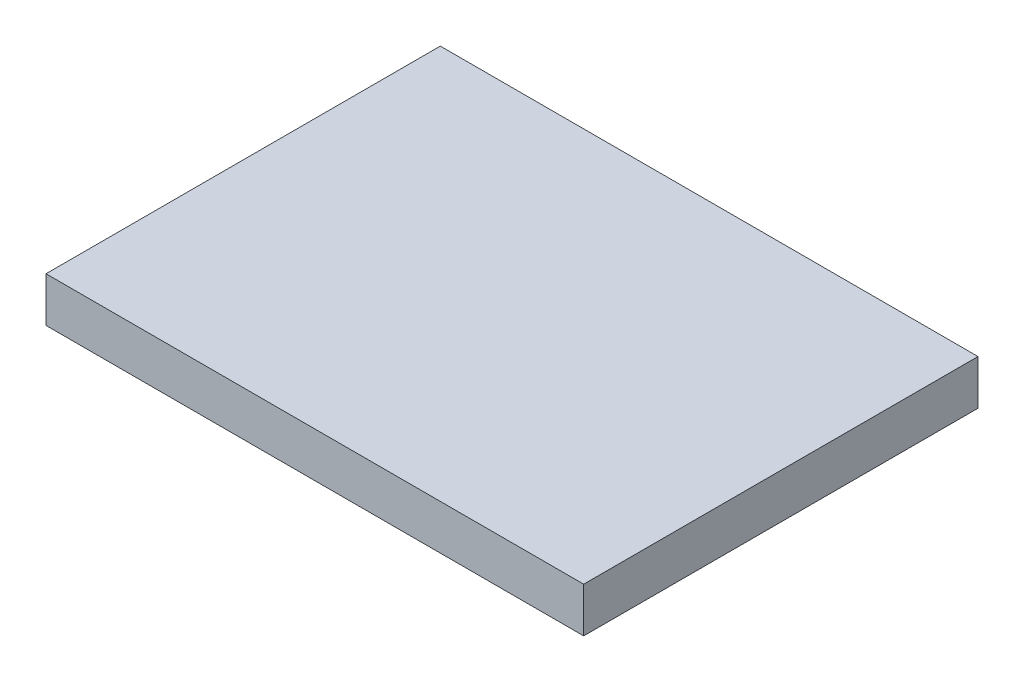
ISO-10303-21;
HEADER;
FILE_DESCRIPTION(('STEP AP214'),'2;1');
FILE_NAME('part.step','',(''),(''),'','','');
FILE_SCHEMA(('AUTOMOTIVE_DESIGN { 1 0 10303 214 1 1 1 1 }'));
ENDSEC;
DATA;
#1=APPLICATION_CONTEXT('core data for automotive mechanical design processes');
#2=APPLICATION_PROTOCOL_DEFINITION('international standard','automotive_design',2000,#1);
#3=PRODUCT_CONTEXT('',#1,'mechanical');
#4=PRODUCT('Part','Part','',(#3));
#5=PRODUCT_RELATED_PRODUCT_CATEGORY('part','',(#4));
#6=PRODUCT_DEFINITION_FORMATION('','',#4);
#7=PRODUCT_DEFINITION_CONTEXT('part definition',#1,'design');
#8=PRODUCT_DEFINITION('design','',#6,#7);
#9=PRODUCT_DEFINITION_SHAPE('','',#8);
#10=(LENGTH_UNIT() NAMED_UNIT(*) SI_UNIT(.MILLI.,.METRE.));
#11=(NAMED_UNIT(*) PLANE_ANGLE_UNIT() SI_UNIT($,.RADIAN.));
#12=(NAMED_UNIT(*) SI_UNIT($,.STERADIAN.) SOLID_ANGLE_UNIT());
#13=UNCERTAINTY_MEASURE_WITH_UNIT(LENGTH_MEASURE(1.E-05),#10,'distance_accuracy_value','');
#14=(GEOMETRIC_REPRESENTATION_CONTEXT(3) GLOBAL_UNCERTAINTY_ASSIGNED_CONTEXT((#13)) GLOBAL_UNIT_ASSIGNED_CONTEXT((#10,
#11,#12)) REPRESENTATION_CONTEXT('',''));
#15=CARTESIAN_POINT('',(0.,0.,0.));
#16=DIRECTION('',(0.,0.,1.));
#17=DIRECTION('',(1.,0.,0.));
#18=AXIS2_PLACEMENT_3D('',#15,#16,#17);
#19=CARTESIAN_POINT('',(87.1296662850509,831.639308698317,11.1125));
#20=DIRECTION('',(0.,0.,-1.));
#21=DIRECTION('',(-1.,0.,0.));
#22=AXIS2_PLACEMENT_3D('',#19,#20,#21);
#23=CYLINDRICAL_SURFACE('',#22,31.75);
#24=CARTESIAN_POINT('',(87.1296662850509,831.639308698317,-11.1125));
#25=DIRECTION('',(0.,0.,1.));
#26=DIRECTION('',(1.,0.,0.));
#27=AXIS2_PLACEMENT_3D('',#24,#25,#26);
#28=CIRCLE('',#27,31.75);
#29=CARTESIAN_POINT('',(118.879666285051,831.639308698317,-11.1125));
#30=VERTEX_POINT('',#29);
#31=CARTESIAN_POINT('',(55.3796662850509,831.639308698317,-11.1125));
#32=VERTEX_POINT('',#31);
#33=EDGE_CURVE('E70',#30,#32,#28,.F.);
#34=ORIENTED_EDGE('',*,*,#33,.F.);
#35=DIRECTION('',(0.,0.,-1.));
#36=VECTOR('',#35,1.);
#37=CARTESIAN_POINT('',(118.879666285051,831.639308698317,11.1125));
#38=LINE('',#37,#36);
#39=CARTESIAN_POINT('',(118.879666285051,831.639308698317,11.1125));
#40=VERTEX_POINT('',#39);
#41=EDGE_CURVE('E11',#40,#30,#38,.T.);
#42=ORIENTED_EDGE('',*,*,#41,.F.);
#43=CARTESIAN_POINT('',(87.1296662850509,831.639308698317,11.1125));
#44=DIRECTION('',(0.,0.,1.));
#45=DIRECTION('',(1.,0.,0.));
#46=AXIS2_PLACEMENT_3D('',#43,#44,#45);
#47=CIRCLE('',#46,31.75);
#48=CARTESIAN_POINT('',(55.3796662850509,831.639308698317,11.1125));
#49=VERTEX_POINT('',#48);
#50=EDGE_CURVE('E72',#40,#49,#47,.F.);
#51=ORIENTED_EDGE('',*,*,#50,.T.);
#52=DIRECTION('',(0.,0.,-1.));
#53=VECTOR('',#52,1.);
#54=CARTESIAN_POINT('',(55.3796662850509,831.639308698317,11.1125));
#55=LINE('',#54,#53);
#56=EDGE_CURVE('E52',#49,#32,#55,.T.);
#57=ORIENTED_EDGE('',*,*,#56,.T.);
#58=EDGE_LOOP('',(#34,#42,#51,#57));
#59=FACE_BOUND('',#58,.T.);
#60=ADVANCED_FACE('F35',(#59),#23,.T.);
#61=CARTESIAN_POINT('',(118.879666285051,304.056568512101,11.1125));
#62=DIRECTION('',(-1.,0.,0.));
#63=DIRECTION('',(0.,0.,1.));
#64=AXIS2_PLACEMENT_3D('',#61,#62,#63);
#65=PLANE('',#64);
#66=DIRECTION('',(0.,1.,0.));
#67=VECTOR('',#66,1.);
#68=CARTESIAN_POINT('',(118.879666285051,304.056568512101,-11.1125));
#69=LINE('',#68,#67);
#70=CARTESIAN_POINT('',(118.879666285051,867.199308698317,-11.1125));
#71=VERTEX_POINT('',#70);
#72=EDGE_CURVE('E84',#30,#71,#69,.T.);
#73=ORIENTED_EDGE('',*,*,#72,.T.);
#74=DIRECTION('',(0.,0.,-1.));
#75=VECTOR('',#74,1.);
#76=CARTESIAN_POINT('',(118.879666285051,867.199308698317,11.1125));
#77=LINE('',#76,#75);
#78=CARTESIAN_POINT('',(118.879666285051,867.199308698317,11.1125));
#79=VERTEX_POINT('',#78);
#80=EDGE_CURVE('E44',#79,#71,#77,.T.);
#81=ORIENTED_EDGE('',*,*,#80,.F.);
#82=DIRECTION('',(0.,1.,0.));
#83=VECTOR('',#82,1.);
#84=CARTESIAN_POINT('',(118.879666285051,304.056568512101,11.1125));
#85=LINE('',#84,#83);
#86=EDGE_CURVE('E105',#40,#79,#85,.T.);
#87=ORIENTED_EDGE('',*,*,#86,.F.);
#88=ORIENTED_EDGE('',*,*,#41,.T.);
#89=EDGE_LOOP('',(#73,#81,#87,#88));
#90=FACE_BOUND('',#89,.T.);
#91=ADVANCED_FACE('F181',(#90),#65,.F.);
#92=CARTESIAN_POINT('',(87.1296662850509,831.639308698317,11.1125));
#93=DIRECTION('',(0.,0.,-1.));
#94=DIRECTION('',(-1.,0.,0.));
#95=AXIS2_PLACEMENT_3D('',#92,#93,#94);
#96=CYLINDRICAL_SURFACE('',#95,7.93750000000001);
#97=CARTESIAN_POINT('',(87.1296662850509,831.639308698317,11.1125));
#98=DIRECTION('',(0.,0.,1.));
#99=DIRECTION('',(1.,0.,0.));
#100=AXIS2_PLACEMENT_3D('',#97,#98,#99);
#101=CIRCLE('',#100,7.93750000000001);
#102=CARTESIAN_POINT('',(95.0671662850509,831.639308698317,11.1125));
#103=VERTEX_POINT('',#102);
#104=EDGE_CURVE('E90',#103,#103,#101,.T.);
#105=ORIENTED_EDGE('',*,*,#104,.T.);
#106=EDGE_LOOP('',(#105));
#107=FACE_BOUND('',#106,.T.);
#108=CARTESIAN_POINT('',(87.1296662850509,831.639308698317,-11.1125));
#109=DIRECTION('',(0.,0.,1.));
#110=DIRECTION('',(1.,0.,0.));
#111=AXIS2_PLACEMENT_3D('',#108,#109,#110);
#112=CIRCLE('',#111,7.93750000000001);
#113=CARTESIAN_POINT('',(95.0671662850509,831.639308698317,-11.1125));
#114=VERTEX_POINT('',#113);
#115=EDGE_CURVE('E85',#114,#114,#112,.T.);
#116=ORIENTED_EDGE('',*,*,#115,.F.);
#117=EDGE_LOOP('',(#116));
#118=FACE_BOUND('',#117,.T.);
#119=ADVANCED_FACE('F37',(#107,#118),#96,.F.);
#120=CARTESIAN_POINT('',(55.3796662850509,304.056568512101,11.1125));
#121=DIRECTION('',(-1.,0.,0.));
#122=DIRECTION('',(0.,0.,1.));
#123=AXIS2_PLACEMENT_3D('',#120,#121,#122);
#124=PLANE('',#123);
#125=DIRECTION('',(0.,1.,0.));
#126=VECTOR('',#125,1.);
#127=CARTESIAN_POINT('',(55.3796662850509,304.056568512101,-11.1125));
#128=LINE('',#127,#126);
#129=CARTESIAN_POINT('',(55.3796662850509,867.199308698317,-11.1125));
#130=VERTEX_POINT('',#129);
#131=EDGE_CURVE('E83',#32,#130,#128,.T.);
#132=ORIENTED_EDGE('',*,*,#131,.F.);
#133=ORIENTED_EDGE('',*,*,#56,.F.);
#134=DIRECTION('',(0.,1.,0.));
#135=VECTOR('',#134,1.);
#136=CARTESIAN_POINT('',(55.3796662850509,304.056568512101,11.1125));
#137=LINE('',#136,#135);
#138=CARTESIAN_POINT('',(55.3796662850509,867.199308698317,11.1125));
#139=VERTEX_POINT('',#138);
#140=EDGE_CURVE('E75',#49,#139,#137,.T.);
#141=ORIENTED_EDGE('',*,*,#140,.T.);
#142=DIRECTION('',(0.,0.,-1.));
#143=VECTOR('',#142,1.);
#144=CARTESIAN_POINT('',(55.3796662850509,867.199308698317,11.1125));
#145=LINE('',#144,#143);
#146=EDGE_CURVE('E74',#139,#130,#145,.T.);
#147=ORIENTED_EDGE('',*,*,#146,.T.);
#148=EDGE_LOOP('',(#132,#133,#141,#147));
#149=FACE_BOUND('',#148,.T.);
#150=ADVANCED_FACE('F88',(#149),#124,.T.);
#151=CARTESIAN_POINT('',(87.1296662850509,304.056568512101,11.1125));
#152=DIRECTION('',(0.,0.,1.));
#153=DIRECTION('',(1.,0.,0.));
#154=AXIS2_PLACEMENT_3D('',#151,#152,#153);
#155=PLANE('',#154);
#156=ORIENTED_EDGE('',*,*,#104,.F.);
#157=EDGE_LOOP('',(#156));
#158=FACE_BOUND('',#157,.T.);
#159=ORIENTED_EDGE('',*,*,#50,.F.);
#160=ORIENTED_EDGE('',*,*,#86,.T.);
#161=DIRECTION('',(1.,0.,0.));
#162=VECTOR('',#161,1.);
#163=CARTESIAN_POINT('',(87.1296662850509,867.199308698317,11.1125));
#164=LINE('',#163,#162);
#165=EDGE_CURVE('E103',#139,#79,#164,.T.);
#166=ORIENTED_EDGE('',*,*,#165,.F.);
#167=ORIENTED_EDGE('',*,*,#140,.F.);
#168=EDGE_LOOP('',(#159,#160,#166,#167));
#169=FACE_BOUND('',#168,.T.);
#170=ADVANCED_FACE('F179',(#158,#169),#155,.T.);
#171=CARTESIAN_POINT('',(87.1296662850509,304.056568512101,-11.1125));
#172=DIRECTION('',(0.,0.,1.));
#173=DIRECTION('',(1.,0.,0.));
#174=AXIS2_PLACEMENT_3D('',#171,#172,#173);
#175=PLANE('',#174);
#176=ORIENTED_EDGE('',*,*,#115,.T.);
#177=EDGE_LOOP('',(#176));
#178=FACE_BOUND('',#177,.T.);
#179=ORIENTED_EDGE('',*,*,#33,.T.);
#180=ORIENTED_EDGE('',*,*,#131,.T.);
#181=DIRECTION('',(1.,0.,0.));
#182=VECTOR('',#181,1.);
#183=CARTESIAN_POINT('',(87.1296662850509,867.199308698317,-11.1125));
#184=LINE('',#183,#182);
#185=EDGE_CURVE('E91',#130,#71,#184,.T.);
#186=ORIENTED_EDGE('',*,*,#185,.T.);
#187=ORIENTED_EDGE('',*,*,#72,.F.);
#188=EDGE_LOOP('',(#179,#180,#186,#187));
#189=FACE_BOUND('',#188,.T.);
#190=ADVANCED_FACE('F80',(#178,#189),#175,.F.);
#191=CARTESIAN_POINT('',(-293.870333714949,930.699308698317,279.4));
#192=DIRECTION('',(1.,0.,0.));
#193=DIRECTION('',(0.,0.,-1.));
#194=AXIS2_PLACEMENT_3D('',#191,#192,#193);
#195=PLANE('',#194);
#196=DIRECTION('',(0.,-1.,0.));
#197=VECTOR('',#196,1.);
#198=CARTESIAN_POINT('',(-293.870333714949,930.699308698317,-279.4));
#199=LINE('',#198,#197);
#200=CARTESIAN_POINT('',(-293.870333714949,930.699308698317,-279.4));
#201=VERTEX_POINT('',#200);
#202=CARTESIAN_POINT('',(-293.870333714949,867.199308698317,-279.4));
#203=VERTEX_POINT('',#202);
#204=EDGE_CURVE('E131',#201,#203,#199,.T.);
#205=ORIENTED_EDGE('',*,*,#204,.T.);
#206=DIRECTION('',(0.,0.,-1.));
#207=VECTOR('',#206,1.);
#208=CARTESIAN_POINT('',(-293.870333714949,867.199308698317,279.4));
#209=LINE('',#208,#207);
#210=CARTESIAN_POINT('',(-293.870333714949,867.199308698317,279.4));
#211=VERTEX_POINT('',#210);
#212=EDGE_CURVE('E101',#211,#203,#209,.T.);
#213=ORIENTED_EDGE('',*,*,#212,.F.);
#214=DIRECTION('',(0.,-1.,0.));
#215=VECTOR('',#214,1.);
#216=CARTESIAN_POINT('',(-293.870333714949,930.699308698317,279.4));
#217=LINE('',#216,#215);
#218=CARTESIAN_POINT('',(-293.870333714949,930.699308698317,279.4));
#219=VERTEX_POINT('',#218);
#220=EDGE_CURVE('E124',#219,#211,#217,.T.);
#221=ORIENTED_EDGE('',*,*,#220,.F.);
#222=DIRECTION('',(0.,0.,-1.));
#223=VECTOR('',#222,1.);
#224=CARTESIAN_POINT('',(-293.870333714949,930.699308698317,279.4));
#225=LINE('',#224,#223);
#226=EDGE_CURVE('E117',#219,#201,#225,.T.);
#227=ORIENTED_EDGE('',*,*,#226,.T.);
#228=EDGE_LOOP('',(#205,#213,#221,#227));
#229=FACE_BOUND('',#228,.T.);
#230=ADVANCED_FACE('F157',(#229),#195,.F.);
#231=CARTESIAN_POINT('',(-293.870333714949,867.199308698317,279.4));
#232=DIRECTION('',(0.,1.,0.));
#233=DIRECTION('',(0.,0.,1.));
#234=AXIS2_PLACEMENT_3D('',#231,#232,#233);
#235=PLANE('',#234);
#236=ORIENTED_EDGE('',*,*,#165,.T.);
#237=ORIENTED_EDGE('',*,*,#80,.T.);
#238=ORIENTED_EDGE('',*,*,#185,.F.);
#239=ORIENTED_EDGE('',*,*,#146,.F.);
#240=EDGE_LOOP('',(#236,#237,#238,#239));
#241=FACE_BOUND('',#240,.T.);
#242=DIRECTION('',(1.,0.,0.));
#243=VECTOR('',#242,1.);
#244=CARTESIAN_POINT('',(-293.870333714949,867.199308698317,-279.4));
#245=LINE('',#244,#243);
#246=CARTESIAN_POINT('',(468.129666285051,867.199308698317,-279.4));
#247=VERTEX_POINT('',#246);
#248=EDGE_CURVE('E128',#203,#247,#245,.T.);
#249=ORIENTED_EDGE('',*,*,#248,.T.);
#250=DIRECTION('',(0.,0.,-1.));
#251=VECTOR('',#250,1.);
#252=CARTESIAN_POINT('',(468.129666285051,867.199308698317,279.4));
#253=LINE('',#252,#251);
#254=CARTESIAN_POINT('',(468.129666285051,867.199308698317,279.4));
#255=VERTEX_POINT('',#254);
#256=EDGE_CURVE('E111',#255,#247,#253,.T.);
#257=ORIENTED_EDGE('',*,*,#256,.F.);
#258=DIRECTION('',(1.,0.,0.));
#259=VECTOR('',#258,1.);
#260=CARTESIAN_POINT('',(-293.870333714949,867.199308698317,279.4));
#261=LINE('',#260,#259);
#262=EDGE_CURVE('E139',#211,#255,#261,.T.);
#263=ORIENTED_EDGE('',*,*,#262,.F.);
#264=ORIENTED_EDGE('',*,*,#212,.T.);
#265=EDGE_LOOP('',(#249,#257,#263,#264));
#266=FACE_BOUND('',#265,.T.);
#267=ADVANCED_FACE('F161',(#241,#266),#235,.F.);
#268=CARTESIAN_POINT('',(468.129666285051,930.699308698317,279.4));
#269=DIRECTION('',(-1.,0.,0.));
#270=DIRECTION('',(0.,0.,1.));
#271=AXIS2_PLACEMENT_3D('',#268,#269,#270);
#272=PLANE('',#271);
#273=DIRECTION('',(0.,1.,0.));
#274=VECTOR('',#273,1.);
#275=CARTESIAN_POINT('',(468.129666285051,930.699308698317,-279.4));
#276=LINE('',#275,#274);
#277=CARTESIAN_POINT('',(468.129666285051,930.699308698317,-279.4));
#278=VERTEX_POINT('',#277);
#279=EDGE_CURVE('E125',#247,#278,#276,.T.);
#280=ORIENTED_EDGE('',*,*,#279,.T.);
#281=DIRECTION('',(0.,0.,-1.));
#282=VECTOR('',#281,1.);
#283=CARTESIAN_POINT('',(468.129666285051,930.699308698317,279.4));
#284=LINE('',#283,#282);
#285=CARTESIAN_POINT('',(468.129666285051,930.699308698317,279.4));
#286=VERTEX_POINT('',#285);
#287=EDGE_CURVE('E114',#286,#278,#284,.T.);
#288=ORIENTED_EDGE('',*,*,#287,.F.);
#289=DIRECTION('',(0.,1.,0.));
#290=VECTOR('',#289,1.);
#291=CARTESIAN_POINT('',(468.129666285051,930.699308698317,279.4));
#292=LINE('',#291,#290);
#293=EDGE_CURVE('E136',#255,#286,#292,.T.);
#294=ORIENTED_EDGE('',*,*,#293,.F.);
#295=ORIENTED_EDGE('',*,*,#256,.T.);
#296=EDGE_LOOP('',(#280,#288,#294,#295));
#297=FACE_BOUND('',#296,.T.);
#298=ADVANCED_FACE('F202',(#297),#272,.F.);
#299=CARTESIAN_POINT('',(-293.870333714949,930.699308698317,279.4));
#300=DIRECTION('',(0.,-1.,0.));
#301=DIRECTION('',(0.,0.,-1.));
#302=AXIS2_PLACEMENT_3D('',#299,#300,#301);
#303=PLANE('',#302);
#304=DIRECTION('',(-1.,0.,0.));
#305=VECTOR('',#304,1.);
#306=CARTESIAN_POINT('',(-293.870333714949,930.699308698317,-279.4));
#307=LINE('',#306,#305);
#308=EDGE_CURVE('E121',#278,#201,#307,.T.);
#309=ORIENTED_EDGE('',*,*,#308,.T.);
#310=ORIENTED_EDGE('',*,*,#226,.F.);
#311=DIRECTION('',(-1.,0.,0.));
#312=VECTOR('',#311,1.);
#313=CARTESIAN_POINT('',(-293.870333714949,930.699308698317,279.4));
#314=LINE('',#313,#312);
#315=EDGE_CURVE('E120',#286,#219,#314,.T.);
#316=ORIENTED_EDGE('',*,*,#315,.F.);
#317=ORIENTED_EDGE('',*,*,#287,.T.);
#318=EDGE_LOOP('',(#309,#310,#316,#317));
#319=FACE_BOUND('',#318,.T.);
#320=ADVANCED_FACE('F205',(#319),#303,.F.);
#321=CARTESIAN_POINT('',(-293.870333714949,867.199308698317,279.4));
#322=DIRECTION('',(0.,0.,1.));
#323=DIRECTION('',(1.,0.,0.));
#324=AXIS2_PLACEMENT_3D('',#321,#322,#323);
#325=PLANE('',#324);
#326=ORIENTED_EDGE('',*,*,#220,.T.);
#327=ORIENTED_EDGE('',*,*,#262,.T.);
#328=ORIENTED_EDGE('',*,*,#293,.T.);
#329=ORIENTED_EDGE('',*,*,#315,.T.);
#330=EDGE_LOOP('',(#326,#327,#328,#329));
#331=FACE_BOUND('',#330,.T.);
#332=ADVANCED_FACE('F147',(#331),#325,.T.);
#333=CARTESIAN_POINT('',(-293.870333714949,867.199308698317,-279.4));
#334=DIRECTION('',(0.,0.,1.));
#335=DIRECTION('',(1.,0.,0.));
#336=AXIS2_PLACEMENT_3D('',#333,#334,#335);
#337=PLANE('',#336);
#338=ORIENTED_EDGE('',*,*,#204,.F.);
#339=ORIENTED_EDGE('',*,*,#308,.F.);
#340=ORIENTED_EDGE('',*,*,#279,.F.);
#341=ORIENTED_EDGE('',*,*,#248,.F.);
#342=EDGE_LOOP('',(#338,#339,#340,#341));
#343=FACE_BOUND('',#342,.T.);
#344=ADVANCED_FACE('F210',(#343),#337,.F.);
#345=CLOSED_SHELL('',(#60,#91,#119,#150,#170,#190,#230,#267,#298,#320,#332,#344));
#346=MANIFOLD_SOLID_BREP('B2',#345);
#347=ADVANCED_BREP_SHAPE_REPRESENTATION('',(#18,#346),#14);
#348=SHAPE_DEFINITION_REPRESENTATION(#9,#347);
ENDSEC;
END-ISO-10303-21;
